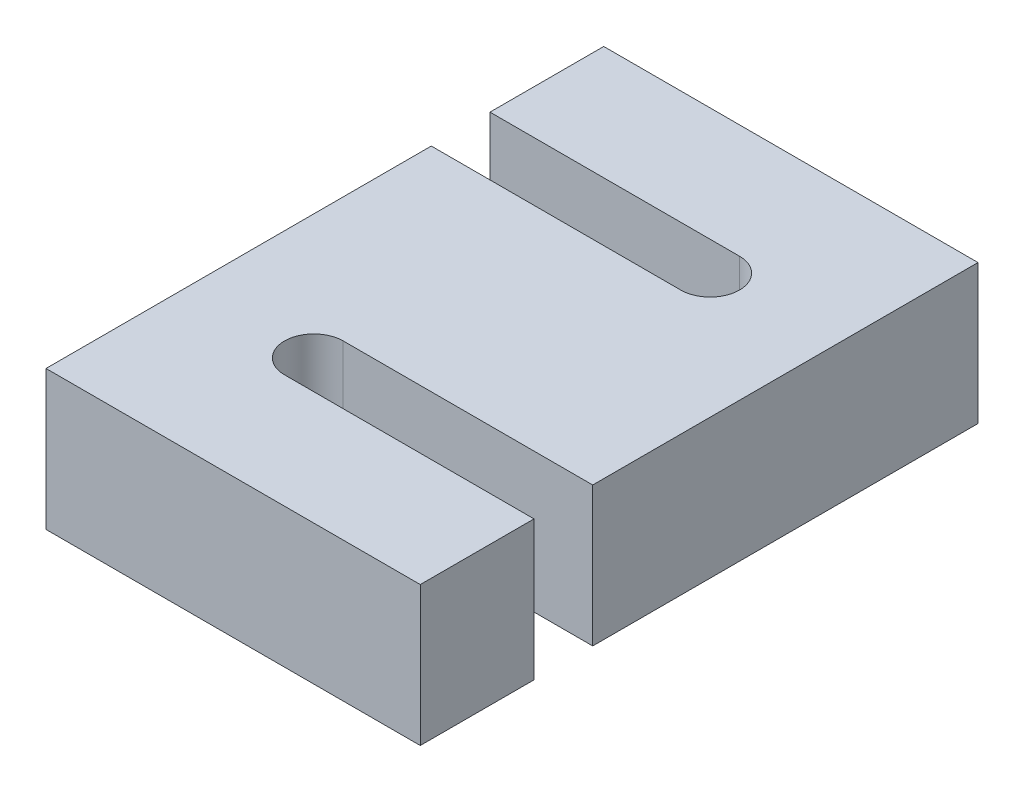
ISO-10303-21;
HEADER;
FILE_DESCRIPTION(('STEP AP214'),'2;1');
FILE_NAME('part.step','',(''),(''),'','','');
FILE_SCHEMA(('AUTOMOTIVE_DESIGN { 1 0 10303 214 1 1 1 1 }'));
ENDSEC;
DATA;
#1=APPLICATION_CONTEXT('core data for automotive mechanical design processes');
#2=APPLICATION_PROTOCOL_DEFINITION('international standard','automotive_design',2000,#1);
#3=PRODUCT_CONTEXT('',#1,'mechanical');
#4=PRODUCT('Part','Part','',(#3));
#5=PRODUCT_RELATED_PRODUCT_CATEGORY('part','',(#4));
#6=PRODUCT_DEFINITION_FORMATION('','',#4);
#7=PRODUCT_DEFINITION_CONTEXT('part definition',#1,'design');
#8=PRODUCT_DEFINITION('design','',#6,#7);
#9=PRODUCT_DEFINITION_SHAPE('','',#8);
#10=(LENGTH_UNIT() NAMED_UNIT(*) SI_UNIT(.MILLI.,.METRE.));
#11=(NAMED_UNIT(*) PLANE_ANGLE_UNIT() SI_UNIT($,.RADIAN.));
#12=(NAMED_UNIT(*) SI_UNIT($,.STERADIAN.) SOLID_ANGLE_UNIT());
#13=UNCERTAINTY_MEASURE_WITH_UNIT(LENGTH_MEASURE(1.E-05),#10,'distance_accuracy_value','');
#14=(GEOMETRIC_REPRESENTATION_CONTEXT(3) GLOBAL_UNCERTAINTY_ASSIGNED_CONTEXT((#13)) GLOBAL_UNIT_ASSIGNED_CONTEXT((#10,
#11,#12)) REPRESENTATION_CONTEXT('',''));
#15=CARTESIAN_POINT('',(0.,0.,0.));
#16=DIRECTION('',(0.,0.,1.));
#17=DIRECTION('',(1.,0.,0.));
#18=AXIS2_PLACEMENT_3D('',#15,#16,#17);
#19=CARTESIAN_POINT('',(25.5,19.,-52.5));
#20=DIRECTION('',(0.,0.,1.));
#21=DIRECTION('',(1.,0.,0.));
#22=AXIS2_PLACEMENT_3D('',#19,#20,#21);
#23=PLANE('',#22);
#24=DIRECTION('',(-1.,0.,0.));
#25=VECTOR('',#24,1.);
#26=CARTESIAN_POINT('',(25.5,0.,-52.5));
#27=LINE('',#26,#25);
#28=CARTESIAN_POINT('',(25.5,0.,-52.5));
#29=VERTEX_POINT('',#28);
#30=CARTESIAN_POINT('',(-25.5,0.,-52.5));
#31=VERTEX_POINT('',#30);
#32=EDGE_CURVE('E170',#29,#31,#27,.T.);
#33=ORIENTED_EDGE('',*,*,#32,.T.);
#34=DIRECTION('',(0.,-1.,0.));
#35=VECTOR('',#34,1.);
#36=CARTESIAN_POINT('',(-25.5,19.,-52.5));
#37=LINE('',#36,#35);
#38=CARTESIAN_POINT('',(-25.5,19.,-52.5));
#39=VERTEX_POINT('',#38);
#40=EDGE_CURVE('E11',#39,#31,#37,.T.);
#41=ORIENTED_EDGE('',*,*,#40,.F.);
#42=DIRECTION('',(-1.,0.,0.));
#43=VECTOR('',#42,1.);
#44=CARTESIAN_POINT('',(25.5,19.,-52.5));
#45=LINE('',#44,#43);
#46=CARTESIAN_POINT('',(25.5,19.,-52.5));
#47=VERTEX_POINT('',#46);
#48=EDGE_CURVE('E204',#47,#39,#45,.T.);
#49=ORIENTED_EDGE('',*,*,#48,.F.);
#50=DIRECTION('',(0.,-1.,0.));
#51=VECTOR('',#50,1.);
#52=CARTESIAN_POINT('',(25.5,19.,-52.5));
#53=LINE('',#52,#51);
#54=EDGE_CURVE('E166',#47,#29,#53,.T.);
#55=ORIENTED_EDGE('',*,*,#54,.T.);
#56=EDGE_LOOP('',(#33,#41,#49,#55));
#57=FACE_BOUND('',#56,.T.);
#58=ADVANCED_FACE('F45',(#57),#23,.F.);
#59=CARTESIAN_POINT('',(-25.5,19.,-52.5));
#60=DIRECTION('',(1.,0.,0.));
#61=DIRECTION('',(0.,0.,-1.));
#62=AXIS2_PLACEMENT_3D('',#59,#60,#61);
#63=PLANE('',#62);
#64=DIRECTION('',(0.,0.,1.));
#65=VECTOR('',#64,1.);
#66=CARTESIAN_POINT('',(-25.5,0.,-52.5));
#67=LINE('',#66,#65);
#68=CARTESIAN_POINT('',(-25.5,0.,-37.));
#69=VERTEX_POINT('',#68);
#70=EDGE_CURVE('E174',#31,#69,#67,.T.);
#71=ORIENTED_EDGE('',*,*,#70,.T.);
#72=DIRECTION('',(0.,-1.,0.));
#73=VECTOR('',#72,1.);
#74=CARTESIAN_POINT('',(-25.5,19.,-37.));
#75=LINE('',#74,#73);
#76=CARTESIAN_POINT('',(-25.5,19.,-37.));
#77=VERTEX_POINT('',#76);
#78=EDGE_CURVE('E54',#77,#69,#75,.T.);
#79=ORIENTED_EDGE('',*,*,#78,.F.);
#80=DIRECTION('',(0.,0.,1.));
#81=VECTOR('',#80,1.);
#82=CARTESIAN_POINT('',(-25.5,19.,-52.5));
#83=LINE('',#82,#81);
#84=EDGE_CURVE('E117',#39,#77,#83,.T.);
#85=ORIENTED_EDGE('',*,*,#84,.F.);
#86=ORIENTED_EDGE('',*,*,#40,.T.);
#87=EDGE_LOOP('',(#71,#79,#85,#86));
#88=FACE_BOUND('',#87,.T.);
#89=ADVANCED_FACE('F298',(#88),#63,.F.);
#90=CARTESIAN_POINT('',(-25.5,19.,-37.));
#91=DIRECTION('',(0.,0.,-1.));
#92=DIRECTION('',(-1.,0.,0.));
#93=AXIS2_PLACEMENT_3D('',#90,#91,#92);
#94=PLANE('',#93);
#95=DIRECTION('',(1.,0.,0.));
#96=VECTOR('',#95,1.);
#97=CARTESIAN_POINT('',(-25.5,0.,-37.));
#98=LINE('',#97,#96);
#99=CARTESIAN_POINT('',(8.49999999999999,0.,-37.));
#100=VERTEX_POINT('',#99);
#101=EDGE_CURVE('E177',#69,#100,#98,.T.);
#102=ORIENTED_EDGE('',*,*,#101,.T.);
#103=DIRECTION('',(0.,-1.,0.));
#104=VECTOR('',#103,1.);
#105=CARTESIAN_POINT('',(8.49999999999999,19.,-37.));
#106=LINE('',#105,#104);
#107=CARTESIAN_POINT('',(8.49999999999999,19.,-37.));
#108=VERTEX_POINT('',#107);
#109=EDGE_CURVE('E231',#108,#100,#106,.T.);
#110=ORIENTED_EDGE('',*,*,#109,.F.);
#111=DIRECTION('',(1.,0.,0.));
#112=VECTOR('',#111,1.);
#113=CARTESIAN_POINT('',(-25.5,19.,-37.));
#114=LINE('',#113,#112);
#115=EDGE_CURVE('E241',#77,#108,#114,.T.);
#116=ORIENTED_EDGE('',*,*,#115,.F.);
#117=ORIENTED_EDGE('',*,*,#78,.T.);
#118=EDGE_LOOP('',(#102,#110,#116,#117));
#119=FACE_BOUND('',#118,.T.);
#120=ADVANCED_FACE('F239',(#119),#94,.F.);
#121=CARTESIAN_POINT('',(8.49999999999999,19.,-33.));
#122=DIRECTION('',(0.,-1.,0.));
#123=DIRECTION('',(0.,0.,-1.));
#124=AXIS2_PLACEMENT_3D('',#121,#122,#123);
#125=CYLINDRICAL_SURFACE('',#124,4.);
#126=CARTESIAN_POINT('',(8.49999999999999,0.,-33.));
#127=DIRECTION('',(0.,-1.,0.));
#128=DIRECTION('',(0.,0.,-1.));
#129=AXIS2_PLACEMENT_3D('',#126,#127,#128);
#130=CIRCLE('',#129,4.);
#131=CARTESIAN_POINT('',(8.49999999999999,0.,-29.));
#132=VERTEX_POINT('',#131);
#133=EDGE_CURVE('E180',#100,#132,#130,.T.);
#134=ORIENTED_EDGE('',*,*,#133,.T.);
#135=DIRECTION('',(0.,-1.,0.));
#136=VECTOR('',#135,1.);
#137=CARTESIAN_POINT('',(8.49999999999999,19.,-29.));
#138=LINE('',#137,#136);
#139=CARTESIAN_POINT('',(8.49999999999999,19.,-29.));
#140=VERTEX_POINT('',#139);
#141=EDGE_CURVE('E227',#140,#132,#138,.T.);
#142=ORIENTED_EDGE('',*,*,#141,.F.);
#143=CARTESIAN_POINT('',(8.49999999999999,19.,-33.));
#144=DIRECTION('',(0.,-1.,0.));
#145=DIRECTION('',(0.,0.,-1.));
#146=AXIS2_PLACEMENT_3D('',#143,#144,#145);
#147=CIRCLE('',#146,4.);
#148=EDGE_CURVE('E260',#108,#140,#147,.T.);
#149=ORIENTED_EDGE('',*,*,#148,.F.);
#150=ORIENTED_EDGE('',*,*,#109,.T.);
#151=EDGE_LOOP('',(#134,#142,#149,#150));
#152=FACE_BOUND('',#151,.T.);
#153=ADVANCED_FACE('F250',(#152),#125,.F.);
#154=CARTESIAN_POINT('',(8.49999999999999,19.,-29.));
#155=DIRECTION('',(0.,0.,1.));
#156=DIRECTION('',(1.,0.,0.));
#157=AXIS2_PLACEMENT_3D('',#154,#155,#156);
#158=PLANE('',#157);
#159=DIRECTION('',(-1.,0.,0.));
#160=VECTOR('',#159,1.);
#161=CARTESIAN_POINT('',(8.49999999999999,0.,-29.));
#162=LINE('',#161,#160);
#163=CARTESIAN_POINT('',(-25.5,0.,-29.));
#164=VERTEX_POINT('',#163);
#165=EDGE_CURVE('E183',#132,#164,#162,.T.);
#166=ORIENTED_EDGE('',*,*,#165,.T.);
#167=DIRECTION('',(0.,-1.,0.));
#168=VECTOR('',#167,1.);
#169=CARTESIAN_POINT('',(-25.5,19.,-29.));
#170=LINE('',#169,#168);
#171=CARTESIAN_POINT('',(-25.5,19.,-29.));
#172=VERTEX_POINT('',#171);
#173=EDGE_CURVE('E223',#172,#164,#170,.T.);
#174=ORIENTED_EDGE('',*,*,#173,.F.);
#175=DIRECTION('',(-1.,0.,0.));
#176=VECTOR('',#175,1.);
#177=CARTESIAN_POINT('',(8.49999999999999,19.,-29.));
#178=LINE('',#177,#176);
#179=EDGE_CURVE('E256',#140,#172,#178,.T.);
#180=ORIENTED_EDGE('',*,*,#179,.F.);
#181=ORIENTED_EDGE('',*,*,#141,.T.);
#182=EDGE_LOOP('',(#166,#174,#180,#181));
#183=FACE_BOUND('',#182,.T.);
#184=ADVANCED_FACE('F254',(#183),#158,.F.);
#185=CARTESIAN_POINT('',(-25.5,19.,-29.));
#186=DIRECTION('',(1.,0.,0.));
#187=DIRECTION('',(0.,0.,-1.));
#188=AXIS2_PLACEMENT_3D('',#185,#186,#187);
#189=PLANE('',#188);
#190=DIRECTION('',(0.,0.,1.));
#191=VECTOR('',#190,1.);
#192=CARTESIAN_POINT('',(-25.5,0.,-29.));
#193=LINE('',#192,#191);
#194=CARTESIAN_POINT('',(-25.5,0.,23.5));
#195=VERTEX_POINT('',#194);
#196=EDGE_CURVE('E186',#164,#195,#193,.T.);
#197=ORIENTED_EDGE('',*,*,#196,.T.);
#198=DIRECTION('',(0.,-1.,0.));
#199=VECTOR('',#198,1.);
#200=CARTESIAN_POINT('',(-25.5,19.,23.5));
#201=LINE('',#200,#199);
#202=CARTESIAN_POINT('',(-25.5,19.,23.5));
#203=VERTEX_POINT('',#202);
#204=EDGE_CURVE('E219',#203,#195,#201,.T.);
#205=ORIENTED_EDGE('',*,*,#204,.F.);
#206=DIRECTION('',(0.,0.,1.));
#207=VECTOR('',#206,1.);
#208=CARTESIAN_POINT('',(-25.5,19.,-29.));
#209=LINE('',#208,#207);
#210=EDGE_CURVE('E259',#172,#203,#209,.T.);
#211=ORIENTED_EDGE('',*,*,#210,.F.);
#212=ORIENTED_EDGE('',*,*,#173,.T.);
#213=EDGE_LOOP('',(#197,#205,#211,#212));
#214=FACE_BOUND('',#213,.T.);
#215=ADVANCED_FACE('F311',(#214),#189,.F.);
#216=CARTESIAN_POINT('',(-25.5,19.,23.5));
#217=DIRECTION('',(0.,0.,-1.));
#218=DIRECTION('',(-1.,0.,0.));
#219=AXIS2_PLACEMENT_3D('',#216,#217,#218);
#220=PLANE('',#219);
#221=DIRECTION('',(1.,0.,0.));
#222=VECTOR('',#221,1.);
#223=CARTESIAN_POINT('',(-25.5,0.,23.5));
#224=LINE('',#223,#222);
#225=CARTESIAN_POINT('',(25.5,0.,23.5));
#226=VERTEX_POINT('',#225);
#227=EDGE_CURVE('E189',#195,#226,#224,.T.);
#228=ORIENTED_EDGE('',*,*,#227,.T.);
#229=DIRECTION('',(0.,-1.,0.));
#230=VECTOR('',#229,1.);
#231=CARTESIAN_POINT('',(25.5,19.,23.5));
#232=LINE('',#231,#230);
#233=CARTESIAN_POINT('',(25.5,19.,23.5));
#234=VERTEX_POINT('',#233);
#235=EDGE_CURVE('E215',#234,#226,#232,.T.);
#236=ORIENTED_EDGE('',*,*,#235,.F.);
#237=DIRECTION('',(1.,0.,0.));
#238=VECTOR('',#237,1.);
#239=CARTESIAN_POINT('',(-25.5,19.,23.5));
#240=LINE('',#239,#238);
#241=EDGE_CURVE('E264',#203,#234,#240,.T.);
#242=ORIENTED_EDGE('',*,*,#241,.F.);
#243=ORIENTED_EDGE('',*,*,#204,.T.);
#244=EDGE_LOOP('',(#228,#236,#242,#243));
#245=FACE_BOUND('',#244,.T.);
#246=ADVANCED_FACE('F314',(#245),#220,.F.);
#247=CARTESIAN_POINT('',(25.5,19.,23.5));
#248=DIRECTION('',(-1.,0.,0.));
#249=DIRECTION('',(0.,0.,1.));
#250=AXIS2_PLACEMENT_3D('',#247,#248,#249);
#251=PLANE('',#250);
#252=DIRECTION('',(0.,0.,-1.));
#253=VECTOR('',#252,1.);
#254=CARTESIAN_POINT('',(25.5,0.,23.5));
#255=LINE('',#254,#253);
#256=CARTESIAN_POINT('',(25.5,0.,7.99999999999999));
#257=VERTEX_POINT('',#256);
#258=EDGE_CURVE('E192',#226,#257,#255,.T.);
#259=ORIENTED_EDGE('',*,*,#258,.T.);
#260=DIRECTION('',(0.,-1.,0.));
#261=VECTOR('',#260,1.);
#262=CARTESIAN_POINT('',(25.5,19.,7.99999999999999));
#263=LINE('',#262,#261);
#264=CARTESIAN_POINT('',(25.5,19.,7.99999999999999));
#265=VERTEX_POINT('',#264);
#266=EDGE_CURVE('E211',#265,#257,#263,.T.);
#267=ORIENTED_EDGE('',*,*,#266,.F.);
#268=DIRECTION('',(0.,0.,-1.));
#269=VECTOR('',#268,1.);
#270=CARTESIAN_POINT('',(25.5,19.,23.5));
#271=LINE('',#270,#269);
#272=EDGE_CURVE('E271',#234,#265,#271,.T.);
#273=ORIENTED_EDGE('',*,*,#272,.F.);
#274=ORIENTED_EDGE('',*,*,#235,.T.);
#275=EDGE_LOOP('',(#259,#267,#273,#274));
#276=FACE_BOUND('',#275,.T.);
#277=ADVANCED_FACE('F279',(#276),#251,.F.);
#278=CARTESIAN_POINT('',(-8.49999999999999,19.,8.));
#279=DIRECTION('',(0.,0.,1.));
#280=DIRECTION('',(1.,0.,0.));
#281=AXIS2_PLACEMENT_3D('',#278,#279,#280);
#282=PLANE('',#281);
#283=DIRECTION('',(-1.,0.,0.));
#284=VECTOR('',#283,1.);
#285=CARTESIAN_POINT('',(-8.49999999999999,0.,8.));
#286=LINE('',#285,#284);
#287=CARTESIAN_POINT('',(-8.49999999999999,0.,8.));
#288=VERTEX_POINT('',#287);
#289=EDGE_CURVE('E195',#257,#288,#286,.T.);
#290=ORIENTED_EDGE('',*,*,#289,.T.);
#291=DIRECTION('',(0.,-1.,0.));
#292=VECTOR('',#291,1.);
#293=CARTESIAN_POINT('',(-8.49999999999999,19.,8.));
#294=LINE('',#293,#292);
#295=CARTESIAN_POINT('',(-8.49999999999999,19.,8.));
#296=VERTEX_POINT('',#295);
#297=EDGE_CURVE('E159',#296,#288,#294,.T.);
#298=ORIENTED_EDGE('',*,*,#297,.F.);
#299=DIRECTION('',(-1.,0.,0.));
#300=VECTOR('',#299,1.);
#301=CARTESIAN_POINT('',(-8.49999999999999,19.,8.));
#302=LINE('',#301,#300);
#303=EDGE_CURVE('E148',#265,#296,#302,.T.);
#304=ORIENTED_EDGE('',*,*,#303,.F.);
#305=ORIENTED_EDGE('',*,*,#266,.T.);
#306=EDGE_LOOP('',(#290,#298,#304,#305));
#307=FACE_BOUND('',#306,.T.);
#308=ADVANCED_FACE('F283',(#307),#282,.F.);
#309=CARTESIAN_POINT('',(-8.49999999999999,19.,4.));
#310=DIRECTION('',(0.,-1.,0.));
#311=DIRECTION('',(0.,0.,-1.));
#312=AXIS2_PLACEMENT_3D('',#309,#310,#311);
#313=CYLINDRICAL_SURFACE('',#312,4.);
#314=CARTESIAN_POINT('',(-8.49999999999999,0.,4.));
#315=DIRECTION('',(0.,-1.,0.));
#316=DIRECTION('',(0.,0.,1.));
#317=AXIS2_PLACEMENT_3D('',#314,#315,#316);
#318=CIRCLE('',#317,4.);
#319=CARTESIAN_POINT('',(-8.49999999999999,0.,0.));
#320=VERTEX_POINT('',#319);
#321=EDGE_CURVE('E157',#288,#320,#318,.T.);
#322=ORIENTED_EDGE('',*,*,#321,.T.);
#323=DIRECTION('',(0.,-1.,0.));
#324=VECTOR('',#323,1.);
#325=CARTESIAN_POINT('',(-8.49999999999999,19.,0.));
#326=LINE('',#325,#324);
#327=CARTESIAN_POINT('',(-8.49999999999999,19.,0.));
#328=VERTEX_POINT('',#327);
#329=EDGE_CURVE('E154',#328,#320,#326,.T.);
#330=ORIENTED_EDGE('',*,*,#329,.F.);
#331=CARTESIAN_POINT('',(-8.49999999999999,19.,4.));
#332=DIRECTION('',(0.,-1.,0.));
#333=DIRECTION('',(0.,0.,1.));
#334=AXIS2_PLACEMENT_3D('',#331,#332,#333);
#335=CIRCLE('',#334,4.);
#336=EDGE_CURVE('E142',#296,#328,#335,.T.);
#337=ORIENTED_EDGE('',*,*,#336,.F.);
#338=ORIENTED_EDGE('',*,*,#297,.T.);
#339=EDGE_LOOP('',(#322,#330,#337,#338));
#340=FACE_BOUND('',#339,.T.);
#341=ADVANCED_FACE('F155',(#340),#313,.F.);
#342=CARTESIAN_POINT('',(25.5,19.,0.));
#343=DIRECTION('',(0.,0.,-1.));
#344=DIRECTION('',(-1.,0.,0.));
#345=AXIS2_PLACEMENT_3D('',#342,#343,#344);
#346=PLANE('',#345);
#347=DIRECTION('',(1.,0.,0.));
#348=VECTOR('',#347,1.);
#349=CARTESIAN_POINT('',(25.5,0.,0.));
#350=LINE('',#349,#348);
#351=CARTESIAN_POINT('',(25.5,0.,0.));
#352=VERTEX_POINT('',#351);
#353=EDGE_CURVE('E103',#320,#352,#350,.T.);
#354=ORIENTED_EDGE('',*,*,#353,.T.);
#355=DIRECTION('',(0.,-1.,0.));
#356=VECTOR('',#355,1.);
#357=CARTESIAN_POINT('',(25.5,19.,0.));
#358=LINE('',#357,#356);
#359=CARTESIAN_POINT('',(25.5,19.,0.));
#360=VERTEX_POINT('',#359);
#361=EDGE_CURVE('E160',#360,#352,#358,.T.);
#362=ORIENTED_EDGE('',*,*,#361,.F.);
#363=DIRECTION('',(1.,0.,0.));
#364=VECTOR('',#363,1.);
#365=CARTESIAN_POINT('',(25.5,19.,0.));
#366=LINE('',#365,#364);
#367=EDGE_CURVE('E146',#328,#360,#366,.T.);
#368=ORIENTED_EDGE('',*,*,#367,.F.);
#369=ORIENTED_EDGE('',*,*,#329,.T.);
#370=EDGE_LOOP('',(#354,#362,#368,#369));
#371=FACE_BOUND('',#370,.T.);
#372=ADVANCED_FACE('F162',(#371),#346,.F.);
#373=CARTESIAN_POINT('',(25.5,19.,0.));
#374=DIRECTION('',(-1.,0.,0.));
#375=DIRECTION('',(0.,0.,1.));
#376=AXIS2_PLACEMENT_3D('',#373,#374,#375);
#377=PLANE('',#376);
#378=DIRECTION('',(0.,0.,-1.));
#379=VECTOR('',#378,1.);
#380=CARTESIAN_POINT('',(25.5,0.,0.));
#381=LINE('',#380,#379);
#382=EDGE_CURVE('E109',#352,#29,#381,.T.);
#383=ORIENTED_EDGE('',*,*,#382,.T.);
#384=ORIENTED_EDGE('',*,*,#54,.F.);
#385=DIRECTION('',(0.,0.,-1.));
#386=VECTOR('',#385,1.);
#387=CARTESIAN_POINT('',(25.5,19.,0.));
#388=LINE('',#387,#386);
#389=EDGE_CURVE('E62',#360,#47,#388,.T.);
#390=ORIENTED_EDGE('',*,*,#389,.F.);
#391=ORIENTED_EDGE('',*,*,#361,.T.);
#392=EDGE_LOOP('',(#383,#384,#390,#391));
#393=FACE_BOUND('',#392,.T.);
#394=ADVANCED_FACE('F287',(#393),#377,.F.);
#395=CARTESIAN_POINT('',(8.49999999999999,19.,-33.));
#396=DIRECTION('',(0.,-1.,0.));
#397=DIRECTION('',(0.,0.,-1.));
#398=AXIS2_PLACEMENT_3D('',#395,#396,#397);
#399=PLANE('',#398);
#400=ORIENTED_EDGE('',*,*,#48,.T.);
#401=ORIENTED_EDGE('',*,*,#84,.T.);
#402=ORIENTED_EDGE('',*,*,#115,.T.);
#403=ORIENTED_EDGE('',*,*,#148,.T.);
#404=ORIENTED_EDGE('',*,*,#179,.T.);
#405=ORIENTED_EDGE('',*,*,#210,.T.);
#406=ORIENTED_EDGE('',*,*,#241,.T.);
#407=ORIENTED_EDGE('',*,*,#272,.T.);
#408=ORIENTED_EDGE('',*,*,#303,.T.);
#409=ORIENTED_EDGE('',*,*,#336,.T.);
#410=ORIENTED_EDGE('',*,*,#367,.T.);
#411=ORIENTED_EDGE('',*,*,#389,.T.);
#412=EDGE_LOOP('',(#400,#401,#402,#403,#404,#405,#406,#407,#408,#409,#410,#411));
#413=FACE_BOUND('',#412,.T.);
#414=ADVANCED_FACE('F144',(#413),#399,.F.);
#415=CARTESIAN_POINT('',(8.49999999999999,0.,-33.));
#416=DIRECTION('',(0.,-1.,0.));
#417=DIRECTION('',(0.,0.,-1.));
#418=AXIS2_PLACEMENT_3D('',#415,#416,#417);
#419=PLANE('',#418);
#420=ORIENTED_EDGE('',*,*,#32,.F.);
#421=ORIENTED_EDGE('',*,*,#382,.F.);
#422=ORIENTED_EDGE('',*,*,#353,.F.);
#423=ORIENTED_EDGE('',*,*,#321,.F.);
#424=ORIENTED_EDGE('',*,*,#289,.F.);
#425=ORIENTED_EDGE('',*,*,#258,.F.);
#426=ORIENTED_EDGE('',*,*,#227,.F.);
#427=ORIENTED_EDGE('',*,*,#196,.F.);
#428=ORIENTED_EDGE('',*,*,#165,.F.);
#429=ORIENTED_EDGE('',*,*,#133,.F.);
#430=ORIENTED_EDGE('',*,*,#101,.F.);
#431=ORIENTED_EDGE('',*,*,#70,.F.);
#432=EDGE_LOOP('',(#420,#421,#422,#423,#424,#425,#426,#427,#428,#429,#430,#431));
#433=FACE_BOUND('',#432,.T.);
#434=ADVANCED_FACE('F245',(#433),#419,.T.);
#435=CLOSED_SHELL('',(#58,#89,#120,#153,#184,#215,#246,#277,#308,#341,#372,#394,#414,#434));
#436=MANIFOLD_SOLID_BREP('B2',#435);
#437=ADVANCED_BREP_SHAPE_REPRESENTATION('',(#18,#436),#14);
#438=SHAPE_DEFINITION_REPRESENTATION(#9,#437);
ENDSEC;
END-ISO-10303-21;
